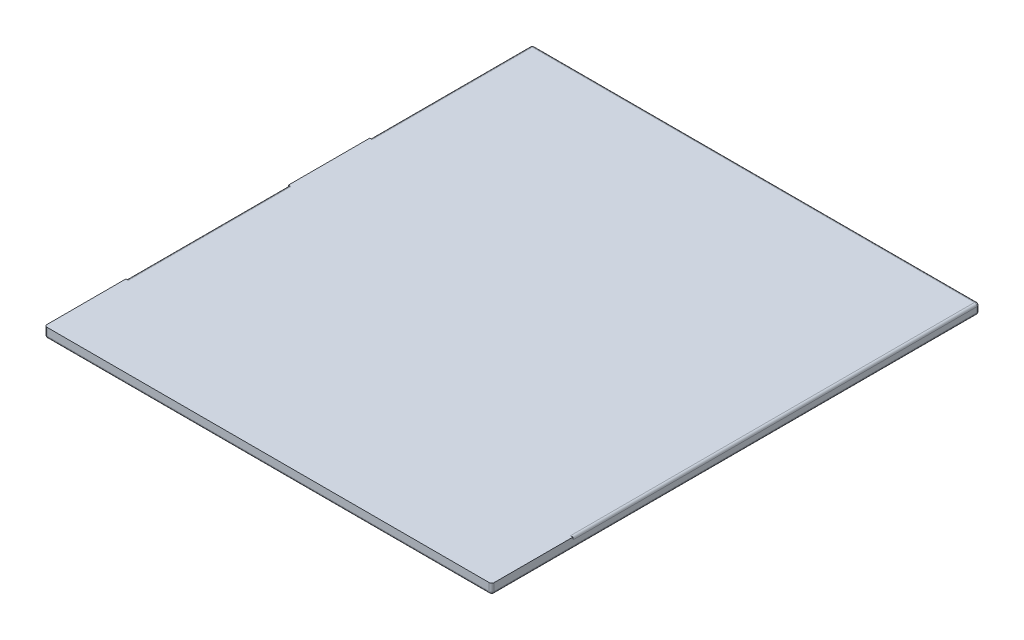
ISO-10303-21;
HEADER;
FILE_DESCRIPTION(('STEP AP214'),'2;1');
FILE_NAME('part.step','',(''),(''),'','','');
FILE_SCHEMA(('AUTOMOTIVE_DESIGN { 1 0 10303 214 1 1 1 1 }'));
ENDSEC;
DATA;
#1=APPLICATION_CONTEXT('core data for automotive mechanical design processes');
#2=APPLICATION_PROTOCOL_DEFINITION('international standard','automotive_design',2000,#1);
#3=PRODUCT_CONTEXT('',#1,'mechanical');
#4=PRODUCT('Part','Part','',(#3));
#5=PRODUCT_RELATED_PRODUCT_CATEGORY('part','',(#4));
#6=PRODUCT_DEFINITION_FORMATION('','',#4);
#7=PRODUCT_DEFINITION_CONTEXT('part definition',#1,'design');
#8=PRODUCT_DEFINITION('design','',#6,#7);
#9=PRODUCT_DEFINITION_SHAPE('','',#8);
#10=(LENGTH_UNIT() NAMED_UNIT(*) SI_UNIT(.MILLI.,.METRE.));
#11=(NAMED_UNIT(*) PLANE_ANGLE_UNIT() SI_UNIT($,.RADIAN.));
#12=(NAMED_UNIT(*) SI_UNIT($,.STERADIAN.) SOLID_ANGLE_UNIT());
#13=UNCERTAINTY_MEASURE_WITH_UNIT(LENGTH_MEASURE(1.E-05),#10,'distance_accuracy_value','');
#14=(GEOMETRIC_REPRESENTATION_CONTEXT(3) GLOBAL_UNCERTAINTY_ASSIGNED_CONTEXT((#13)) GLOBAL_UNIT_ASSIGNED_CONTEXT((#10,
#11,#12)) REPRESENTATION_CONTEXT('',''));
#15=CARTESIAN_POINT('',(0.,0.,0.));
#16=DIRECTION('',(0.,0.,1.));
#17=DIRECTION('',(1.,0.,0.));
#18=AXIS2_PLACEMENT_3D('',#15,#16,#17);
#19=CARTESIAN_POINT('',(0.,3.175,0.));
#20=DIRECTION('',(1.,0.,0.));
#21=DIRECTION('',(0.,0.,-1.));
#22=AXIS2_PLACEMENT_3D('',#19,#20,#21);
#23=PLANE('',#22);
#24=DIRECTION('',(0.,0.,1.));
#25=VECTOR('',#24,1.);
#26=CARTESIAN_POINT('',(0.,2.413,0.));
#27=LINE('',#26,#25);
#28=CARTESIAN_POINT('',(0.,2.413,-101.6));
#29=VERTEX_POINT('',#28);
#30=CARTESIAN_POINT('',(0.,2.413,-151.638));
#31=VERTEX_POINT('',#30);
#32=EDGE_CURVE('E258',#29,#31,#27,.F.);
#33=ORIENTED_EDGE('',*,*,#32,.T.);
#34=DIRECTION('',(0.,-1.,0.));
#35=VECTOR('',#34,1.);
#36=CARTESIAN_POINT('',(0.,3.175,-151.638));
#37=LINE('',#36,#35);
#38=CARTESIAN_POINT('',(0.,0.762,-151.638));
#39=VERTEX_POINT('',#38);
#40=EDGE_CURVE('E11',#31,#39,#37,.T.);
#41=ORIENTED_EDGE('',*,*,#40,.T.);
#42=DIRECTION('',(0.,0.,1.));
#43=VECTOR('',#42,1.);
#44=CARTESIAN_POINT('',(0.,0.762,0.));
#45=LINE('',#44,#43);
#46=CARTESIAN_POINT('',(0.,0.762,-0.762));
#47=VERTEX_POINT('',#46);
#48=EDGE_CURVE('E218',#39,#47,#45,.T.);
#49=ORIENTED_EDGE('',*,*,#48,.T.);
#50=DIRECTION('',(0.,-1.,0.));
#51=VECTOR('',#50,1.);
#52=CARTESIAN_POINT('',(0.,3.175,-0.762));
#53=LINE('',#52,#51);
#54=CARTESIAN_POINT('',(0.,3.175,-0.762));
#55=VERTEX_POINT('',#54);
#56=EDGE_CURVE('E216',#47,#55,#53,.F.);
#57=ORIENTED_EDGE('',*,*,#56,.T.);
#58=DIRECTION('',(0.,0.,1.));
#59=VECTOR('',#58,1.);
#60=CARTESIAN_POINT('',(0.,3.175,0.));
#61=LINE('',#60,#59);
#62=CARTESIAN_POINT('',(0.,3.175,-25.4));
#63=VERTEX_POINT('',#62);
#64=EDGE_CURVE('E170',#63,#55,#61,.T.);
#65=ORIENTED_EDGE('',*,*,#64,.F.);
#66=DIRECTION('',(0.,-1.,0.));
#67=VECTOR('',#66,1.);
#68=CARTESIAN_POINT('',(0.,2.413,-25.4));
#69=LINE('',#68,#67);
#70=CARTESIAN_POINT('',(0.,2.413,-25.4));
#71=VERTEX_POINT('',#70);
#72=EDGE_CURVE('E275',#63,#71,#69,.T.);
#73=ORIENTED_EDGE('',*,*,#72,.T.);
#74=DIRECTION('',(0.,0.,1.));
#75=VECTOR('',#74,1.);
#76=CARTESIAN_POINT('',(0.,2.413,0.));
#77=LINE('',#76,#75);
#78=CARTESIAN_POINT('',(0.,2.413,-76.1999999999998));
#79=VERTEX_POINT('',#78);
#80=EDGE_CURVE('E273',#71,#79,#77,.F.);
#81=ORIENTED_EDGE('',*,*,#80,.T.);
#82=DIRECTION('',(0.,1.,0.));
#83=VECTOR('',#82,1.);
#84=CARTESIAN_POINT('',(0.,2.413,-76.1999999999998));
#85=LINE('',#84,#83);
#86=CARTESIAN_POINT('',(0.,3.175,-76.1999999999997));
#87=VERTEX_POINT('',#86);
#88=EDGE_CURVE('E271',#79,#87,#85,.T.);
#89=ORIENTED_EDGE('',*,*,#88,.T.);
#90=CARTESIAN_POINT('',(0.,3.175,-101.6));
#91=VERTEX_POINT('',#90);
#92=EDGE_CURVE('E186',#91,#87,#61,.T.);
#93=ORIENTED_EDGE('',*,*,#92,.F.);
#94=DIRECTION('',(0.,-1.,0.));
#95=VECTOR('',#94,1.);
#96=CARTESIAN_POINT('',(0.,2.413,-101.6));
#97=LINE('',#96,#95);
#98=EDGE_CURVE('E260',#91,#29,#97,.T.);
#99=ORIENTED_EDGE('',*,*,#98,.T.);
#100=EDGE_LOOP('',(#33,#41,#49,#57,#65,#73,#81,#89,#93,#99));
#101=FACE_BOUND('',#100,.T.);
#102=ADVANCED_FACE('F43',(#101),#23,.F.);
#103=CARTESIAN_POINT('',(0.,3.175,0.));
#104=DIRECTION('',(0.,0.,-1.));
#105=DIRECTION('',(-1.,0.,0.));
#106=AXIS2_PLACEMENT_3D('',#103,#104,#105);
#107=PLANE('',#106);
#108=DIRECTION('',(1.,0.,0.));
#109=VECTOR('',#108,1.);
#110=CARTESIAN_POINT('',(0.,3.175,0.));
#111=LINE('',#110,#109);
#112=CARTESIAN_POINT('',(0.762,3.175,0.));
#113=VERTEX_POINT('',#112);
#114=CARTESIAN_POINT('',(138.938,3.175,0.));
#115=VERTEX_POINT('',#114);
#116=EDGE_CURVE('E167',#113,#115,#111,.T.);
#117=ORIENTED_EDGE('',*,*,#116,.F.);
#118=DIRECTION('',(0.,-1.,0.));
#119=VECTOR('',#118,1.);
#120=CARTESIAN_POINT('',(0.762,3.175,0.));
#121=LINE('',#120,#119);
#122=CARTESIAN_POINT('',(0.762,0.762,0.));
#123=VERTEX_POINT('',#122);
#124=EDGE_CURVE('E181',#113,#123,#121,.T.);
#125=ORIENTED_EDGE('',*,*,#124,.T.);
#126=DIRECTION('',(1.,0.,0.));
#127=VECTOR('',#126,1.);
#128=CARTESIAN_POINT('',(139.7,0.762,0.));
#129=LINE('',#128,#127);
#130=CARTESIAN_POINT('',(138.938,0.762,0.));
#131=VERTEX_POINT('',#130);
#132=EDGE_CURVE('E193',#123,#131,#129,.T.);
#133=ORIENTED_EDGE('',*,*,#132,.T.);
#134=DIRECTION('',(0.,-1.,0.));
#135=VECTOR('',#134,1.);
#136=CARTESIAN_POINT('',(138.938,3.175,0.));
#137=LINE('',#136,#135);
#138=EDGE_CURVE('E184',#131,#115,#137,.F.);
#139=ORIENTED_EDGE('',*,*,#138,.T.);
#140=EDGE_LOOP('',(#117,#125,#133,#139));
#141=FACE_BOUND('',#140,.T.);
#142=ADVANCED_FACE('F179',(#141),#107,.F.);
#143=CARTESIAN_POINT('',(139.7,3.175,0.));
#144=DIRECTION('',(-1.,0.,0.));
#145=DIRECTION('',(0.,0.,1.));
#146=AXIS2_PLACEMENT_3D('',#143,#144,#145);
#147=PLANE('',#146);
#148=DIRECTION('',(0.,0.,-1.));
#149=VECTOR('',#148,1.);
#150=CARTESIAN_POINT('',(139.7,0.762,-152.4));
#151=LINE('',#150,#149);
#152=CARTESIAN_POINT('',(139.7,0.762,-0.762));
#153=VERTEX_POINT('',#152);
#154=CARTESIAN_POINT('',(139.7,0.762,-151.638));
#155=VERTEX_POINT('',#154);
#156=EDGE_CURVE('E210',#153,#155,#151,.T.);
#157=ORIENTED_EDGE('',*,*,#156,.T.);
#158=DIRECTION('',(0.,-1.,0.));
#159=VECTOR('',#158,1.);
#160=CARTESIAN_POINT('',(139.7,3.175,-151.638));
#161=LINE('',#160,#159);
#162=CARTESIAN_POINT('',(139.7,2.413,-151.638));
#163=VERTEX_POINT('',#162);
#164=EDGE_CURVE('E52',#155,#163,#161,.F.);
#165=ORIENTED_EDGE('',*,*,#164,.T.);
#166=DIRECTION('',(0.,0.,-1.));
#167=VECTOR('',#166,1.);
#168=CARTESIAN_POINT('',(139.7,2.413,0.));
#169=LINE('',#168,#167);
#170=CARTESIAN_POINT('',(139.7,2.413,-25.4));
#171=VERTEX_POINT('',#170);
#172=EDGE_CURVE('E243',#163,#171,#169,.F.);
#173=ORIENTED_EDGE('',*,*,#172,.T.);
#174=DIRECTION('',(0.,1.,0.));
#175=VECTOR('',#174,1.);
#176=CARTESIAN_POINT('',(139.7,2.413,-25.4));
#177=LINE('',#176,#175);
#178=CARTESIAN_POINT('',(139.7,3.175,-25.4));
#179=VERTEX_POINT('',#178);
#180=EDGE_CURVE('E241',#171,#179,#177,.T.);
#181=ORIENTED_EDGE('',*,*,#180,.T.);
#182=DIRECTION('',(0.,0.,-1.));
#183=VECTOR('',#182,1.);
#184=CARTESIAN_POINT('',(139.7,3.175,0.));
#185=LINE('',#184,#183);
#186=CARTESIAN_POINT('',(139.7,3.175,-0.762));
#187=VERTEX_POINT('',#186);
#188=EDGE_CURVE('E185',#187,#179,#185,.T.);
#189=ORIENTED_EDGE('',*,*,#188,.F.);
#190=DIRECTION('',(0.,-1.,0.));
#191=VECTOR('',#190,1.);
#192=CARTESIAN_POINT('',(139.7,3.175,-0.762));
#193=LINE('',#192,#191);
#194=EDGE_CURVE('E208',#187,#153,#193,.T.);
#195=ORIENTED_EDGE('',*,*,#194,.T.);
#196=EDGE_LOOP('',(#157,#165,#173,#181,#189,#195));
#197=FACE_BOUND('',#196,.T.);
#198=ADVANCED_FACE('F346',(#197),#147,.F.);
#199=CARTESIAN_POINT('',(0.,3.175,-152.4));
#200=DIRECTION('',(0.,0.,1.));
#201=DIRECTION('',(1.,0.,0.));
#202=AXIS2_PLACEMENT_3D('',#199,#200,#201);
#203=PLANE('',#202);
#204=DIRECTION('',(-1.,0.,0.));
#205=VECTOR('',#204,1.);
#206=CARTESIAN_POINT('',(0.,2.413,-152.4));
#207=LINE('',#206,#205);
#208=CARTESIAN_POINT('',(0.761999999999972,2.413,-152.4));
#209=VERTEX_POINT('',#208);
#210=CARTESIAN_POINT('',(138.938,2.413,-152.4));
#211=VERTEX_POINT('',#210);
#212=EDGE_CURVE('E250',#209,#211,#207,.F.);
#213=ORIENTED_EDGE('',*,*,#212,.T.);
#214=DIRECTION('',(0.,-1.,0.));
#215=VECTOR('',#214,1.);
#216=CARTESIAN_POINT('',(138.938,3.175,-152.4));
#217=LINE('',#216,#215);
#218=CARTESIAN_POINT('',(138.938,0.762,-152.4));
#219=VERTEX_POINT('',#218);
#220=EDGE_CURVE('E301',#211,#219,#217,.T.);
#221=ORIENTED_EDGE('',*,*,#220,.T.);
#222=DIRECTION('',(-1.,0.,0.));
#223=VECTOR('',#222,1.);
#224=CARTESIAN_POINT('',(0.,0.762,-152.4));
#225=LINE('',#224,#223);
#226=CARTESIAN_POINT('',(0.761999999999972,0.762,-152.4));
#227=VERTEX_POINT('',#226);
#228=EDGE_CURVE('E213',#219,#227,#225,.T.);
#229=ORIENTED_EDGE('',*,*,#228,.T.);
#230=DIRECTION('',(0.,-1.,0.));
#231=VECTOR('',#230,1.);
#232=CARTESIAN_POINT('',(0.761999999999972,3.175,-152.4));
#233=LINE('',#232,#231);
#234=EDGE_CURVE('E299',#227,#209,#233,.F.);
#235=ORIENTED_EDGE('',*,*,#234,.T.);
#236=EDGE_LOOP('',(#213,#221,#229,#235));
#237=FACE_BOUND('',#236,.T.);
#238=ADVANCED_FACE('F616',(#237),#203,.F.);
#239=CARTESIAN_POINT('',(0.,3.175,0.));
#240=DIRECTION('',(0.,-1.,0.));
#241=DIRECTION('',(0.,0.,-1.));
#242=AXIS2_PLACEMENT_3D('',#239,#240,#241);
#243=PLANE('',#242);
#244=ORIENTED_EDGE('',*,*,#92,.T.);
#245=DIRECTION('',(1.,0.,0.));
#246=VECTOR('',#245,1.);
#247=CARTESIAN_POINT('',(0.761999999999986,3.175,-76.1999999999998));
#248=LINE('',#247,#246);
#249=CARTESIAN_POINT('',(0.761999999999986,3.175,-76.1999999999998));
#250=VERTEX_POINT('',#249);
#251=EDGE_CURVE('E268',#87,#250,#248,.T.);
#252=ORIENTED_EDGE('',*,*,#251,.T.);
#253=DIRECTION('',(0.,0.,1.));
#254=VECTOR('',#253,1.);
#255=CARTESIAN_POINT('',(0.762,3.175,0.));
#256=LINE('',#255,#254);
#257=CARTESIAN_POINT('',(0.761999999999995,3.175,-25.4));
#258=VERTEX_POINT('',#257);
#259=EDGE_CURVE('E266',#250,#258,#256,.T.);
#260=ORIENTED_EDGE('',*,*,#259,.T.);
#261=DIRECTION('',(-1.,0.,0.));
#262=VECTOR('',#261,1.);
#263=CARTESIAN_POINT('',(0.761999999999995,3.175,-25.4));
#264=LINE('',#263,#262);
#265=EDGE_CURVE('E262',#258,#63,#264,.T.);
#266=ORIENTED_EDGE('',*,*,#265,.T.);
#267=ORIENTED_EDGE('',*,*,#64,.T.);
#268=CARTESIAN_POINT('',(0.762,3.175,-0.762));
#269=DIRECTION('',(0.,-1.,0.));
#270=DIRECTION('',(0.,0.,-1.));
#271=AXIS2_PLACEMENT_3D('',#268,#269,#270);
#272=CIRCLE('',#271,0.762);
#273=EDGE_CURVE('E163',#55,#113,#272,.F.);
#274=ORIENTED_EDGE('',*,*,#273,.T.);
#275=ORIENTED_EDGE('',*,*,#116,.T.);
#276=CARTESIAN_POINT('',(138.938,3.175,-0.762));
#277=DIRECTION('',(0.,-1.,0.));
#278=DIRECTION('',(0.,0.,-1.));
#279=AXIS2_PLACEMENT_3D('',#276,#277,#278);
#280=CIRCLE('',#279,0.762);
#281=EDGE_CURVE('E176',#115,#187,#280,.F.);
#282=ORIENTED_EDGE('',*,*,#281,.T.);
#283=ORIENTED_EDGE('',*,*,#188,.T.);
#284=DIRECTION('',(-1.,0.,0.));
#285=VECTOR('',#284,1.);
#286=CARTESIAN_POINT('',(138.938,3.175,-25.4));
#287=LINE('',#286,#285);
#288=CARTESIAN_POINT('',(138.938,3.175,-25.4));
#289=VERTEX_POINT('',#288);
#290=EDGE_CURVE('E238',#179,#289,#287,.T.);
#291=ORIENTED_EDGE('',*,*,#290,.T.);
#292=DIRECTION('',(0.,0.,-1.));
#293=VECTOR('',#292,1.);
#294=CARTESIAN_POINT('',(138.938,3.175,0.));
#295=LINE('',#294,#293);
#296=CARTESIAN_POINT('',(138.938,3.175,-151.638));
#297=VERTEX_POINT('',#296);
#298=EDGE_CURVE('E175',#289,#297,#295,.T.);
#299=ORIENTED_EDGE('',*,*,#298,.T.);
#300=DIRECTION('',(-1.,0.,0.));
#301=VECTOR('',#300,1.);
#302=CARTESIAN_POINT('',(0.,3.175,-151.638));
#303=LINE('',#302,#301);
#304=CARTESIAN_POINT('',(0.761999999999972,3.175,-151.638));
#305=VERTEX_POINT('',#304);
#306=EDGE_CURVE('E245',#297,#305,#303,.T.);
#307=ORIENTED_EDGE('',*,*,#306,.T.);
#308=DIRECTION('',(0.,0.,1.));
#309=VECTOR('',#308,1.);
#310=CARTESIAN_POINT('',(0.762,3.175,0.));
#311=LINE('',#310,#309);
#312=CARTESIAN_POINT('',(0.761999999999982,3.175,-101.6));
#313=VERTEX_POINT('',#312);
#314=EDGE_CURVE('E255',#305,#313,#311,.T.);
#315=ORIENTED_EDGE('',*,*,#314,.T.);
#316=DIRECTION('',(-1.,0.,0.));
#317=VECTOR('',#316,1.);
#318=CARTESIAN_POINT('',(0.761999999999981,3.175,-101.6));
#319=LINE('',#318,#317);
#320=EDGE_CURVE('E253',#313,#91,#319,.T.);
#321=ORIENTED_EDGE('',*,*,#320,.T.);
#322=EDGE_LOOP('',(#244,#252,#260,#266,#267,#274,#275,#282,#283,#291,#299,#307,#315,#321));
#323=FACE_BOUND('',#322,.T.);
#324=ADVANCED_FACE('F166',(#323),#243,.F.);
#325=CARTESIAN_POINT('',(0.,0.,0.));
#326=DIRECTION('',(0.,-1.,0.));
#327=DIRECTION('',(0.,0.,-1.));
#328=AXIS2_PLACEMENT_3D('',#325,#326,#327);
#329=PLANE('',#328);
#330=DIRECTION('',(0.,0.,-1.));
#331=VECTOR('',#330,1.);
#332=CARTESIAN_POINT('',(138.938,0.,0.));
#333=LINE('',#332,#331);
#334=CARTESIAN_POINT('',(138.938,0.,-151.638));
#335=VERTEX_POINT('',#334);
#336=CARTESIAN_POINT('',(138.938,0.,-0.762));
#337=VERTEX_POINT('',#336);
#338=EDGE_CURVE('E203',#335,#337,#333,.F.);
#339=ORIENTED_EDGE('',*,*,#338,.T.);
#340=DIRECTION('',(1.,0.,0.));
#341=VECTOR('',#340,1.);
#342=CARTESIAN_POINT('',(0.,0.,-0.762));
#343=LINE('',#342,#341);
#344=CARTESIAN_POINT('',(0.762,0.,-0.762));
#345=VERTEX_POINT('',#344);
#346=EDGE_CURVE('E205',#337,#345,#343,.F.);
#347=ORIENTED_EDGE('',*,*,#346,.T.);
#348=DIRECTION('',(0.,0.,1.));
#349=VECTOR('',#348,1.);
#350=CARTESIAN_POINT('',(0.761999999999972,0.,-152.4));
#351=LINE('',#350,#349);
#352=CARTESIAN_POINT('',(0.761999999999972,0.,-151.638));
#353=VERTEX_POINT('',#352);
#354=EDGE_CURVE('E192',#345,#353,#351,.F.);
#355=ORIENTED_EDGE('',*,*,#354,.T.);
#356=DIRECTION('',(-1.,0.,0.));
#357=VECTOR('',#356,1.);
#358=CARTESIAN_POINT('',(139.7,0.,-151.638));
#359=LINE('',#358,#357);
#360=EDGE_CURVE('E196',#353,#335,#359,.F.);
#361=ORIENTED_EDGE('',*,*,#360,.T.);
#362=EDGE_LOOP('',(#339,#347,#355,#361));
#363=FACE_BOUND('',#362,.T.);
#364=ADVANCED_FACE('F327',(#363),#329,.T.);
#365=CARTESIAN_POINT('',(0.,0.762,-151.638));
#366=DIRECTION('',(1.,0.,0.));
#367=DIRECTION('',(0.,0.,-1.));
#368=AXIS2_PLACEMENT_3D('',#365,#366,#367);
#369=CYLINDRICAL_SURFACE('',#368,0.762);
#370=ORIENTED_EDGE('',*,*,#228,.F.);
#371=CARTESIAN_POINT('',(138.938,0.762,-151.638));
#372=DIRECTION('',(1.,0.,0.));
#373=DIRECTION('',(0.,0.,-1.));
#374=AXIS2_PLACEMENT_3D('',#371,#372,#373);
#375=CIRCLE('',#374,0.762);
#376=EDGE_CURVE('E294',#219,#335,#375,.F.);
#377=ORIENTED_EDGE('',*,*,#376,.T.);
#378=ORIENTED_EDGE('',*,*,#360,.F.);
#379=CARTESIAN_POINT('',(0.761999999999972,0.762,-151.638));
#380=DIRECTION('',(1.,0.,0.));
#381=DIRECTION('',(0.,0.,-1.));
#382=AXIS2_PLACEMENT_3D('',#379,#380,#381);
#383=CIRCLE('',#382,0.762);
#384=EDGE_CURVE('E292',#353,#227,#383,.T.);
#385=ORIENTED_EDGE('',*,*,#384,.T.);
#386=EDGE_LOOP('',(#370,#377,#378,#385));
#387=FACE_BOUND('',#386,.T.);
#388=ADVANCED_FACE('F332',(#387),#369,.T.);
#389=CARTESIAN_POINT('',(0.762,0.762,0.));
#390=DIRECTION('',(0.,0.,-1.));
#391=DIRECTION('',(-1.,0.,0.));
#392=AXIS2_PLACEMENT_3D('',#389,#390,#391);
#393=CYLINDRICAL_SURFACE('',#392,0.762);
#394=ORIENTED_EDGE('',*,*,#48,.F.);
#395=CARTESIAN_POINT('',(0.761999999999972,0.762,-151.638));
#396=DIRECTION('',(0.,0.,-1.));
#397=DIRECTION('',(-1.,0.,0.));
#398=AXIS2_PLACEMENT_3D('',#395,#396,#397);
#399=CIRCLE('',#398,0.762);
#400=EDGE_CURVE('E297',#39,#353,#399,.F.);
#401=ORIENTED_EDGE('',*,*,#400,.T.);
#402=ORIENTED_EDGE('',*,*,#354,.F.);
#403=CARTESIAN_POINT('',(0.762,0.762,-0.762));
#404=DIRECTION('',(0.,0.,1.));
#405=DIRECTION('',(1.,0.,0.));
#406=AXIS2_PLACEMENT_3D('',#403,#404,#405);
#407=CIRCLE('',#406,0.762);
#408=EDGE_CURVE('E233',#47,#345,#407,.T.);
#409=ORIENTED_EDGE('',*,*,#408,.F.);
#410=EDGE_LOOP('',(#394,#401,#402,#409));
#411=FACE_BOUND('',#410,.T.);
#412=ADVANCED_FACE('F323',(#411),#393,.T.);
#413=CARTESIAN_POINT('',(0.762,3.175,-0.762));
#414=DIRECTION('',(0.,-1.,0.));
#415=DIRECTION('',(0.,0.,-1.));
#416=AXIS2_PLACEMENT_3D('',#413,#414,#415);
#417=CYLINDRICAL_SURFACE('',#416,0.762);
#418=ORIENTED_EDGE('',*,*,#273,.F.);
#419=ORIENTED_EDGE('',*,*,#56,.F.);
#420=CARTESIAN_POINT('',(0.762,0.762,-0.762));
#421=DIRECTION('',(0.,-1.,0.));
#422=DIRECTION('',(0.,0.,-1.));
#423=AXIS2_PLACEMENT_3D('',#420,#421,#422);
#424=CIRCLE('',#423,0.762);
#425=EDGE_CURVE('E190',#123,#47,#424,.T.);
#426=ORIENTED_EDGE('',*,*,#425,.F.);
#427=ORIENTED_EDGE('',*,*,#124,.F.);
#428=EDGE_LOOP('',(#418,#419,#426,#427));
#429=FACE_BOUND('',#428,.T.);
#430=ADVANCED_FACE('F188',(#429),#417,.T.);
#431=CARTESIAN_POINT('',(138.938,3.175,-0.762));
#432=DIRECTION('',(0.,-1.,0.));
#433=DIRECTION('',(0.,0.,-1.));
#434=AXIS2_PLACEMENT_3D('',#431,#432,#433);
#435=CYLINDRICAL_SURFACE('',#434,0.762);
#436=ORIENTED_EDGE('',*,*,#281,.F.);
#437=ORIENTED_EDGE('',*,*,#138,.F.);
#438=CARTESIAN_POINT('',(138.938,0.762,-0.762));
#439=DIRECTION('',(0.,-1.,0.));
#440=DIRECTION('',(0.,0.,-1.));
#441=AXIS2_PLACEMENT_3D('',#438,#439,#440);
#442=CIRCLE('',#441,0.762);
#443=EDGE_CURVE('E229',#153,#131,#442,.T.);
#444=ORIENTED_EDGE('',*,*,#443,.F.);
#445=ORIENTED_EDGE('',*,*,#194,.F.);
#446=EDGE_LOOP('',(#436,#437,#444,#445));
#447=FACE_BOUND('',#446,.T.);
#448=ADVANCED_FACE('F389',(#447),#435,.T.);
#449=CARTESIAN_POINT('',(138.938,0.762,0.));
#450=DIRECTION('',(0.,0.,1.));
#451=DIRECTION('',(1.,0.,0.));
#452=AXIS2_PLACEMENT_3D('',#449,#450,#451);
#453=CYLINDRICAL_SURFACE('',#452,0.762);
#454=ORIENTED_EDGE('',*,*,#338,.F.);
#455=CARTESIAN_POINT('',(138.938,0.762,-151.638));
#456=DIRECTION('',(0.,0.,1.));
#457=DIRECTION('',(1.,0.,0.));
#458=AXIS2_PLACEMENT_3D('',#455,#456,#457);
#459=CIRCLE('',#458,0.762);
#460=EDGE_CURVE('E290',#335,#155,#459,.T.);
#461=ORIENTED_EDGE('',*,*,#460,.T.);
#462=ORIENTED_EDGE('',*,*,#156,.F.);
#463=CARTESIAN_POINT('',(138.938,0.762,-0.762));
#464=DIRECTION('',(0.,0.,1.));
#465=DIRECTION('',(1.,0.,0.));
#466=AXIS2_PLACEMENT_3D('',#463,#464,#465);
#467=CIRCLE('',#466,0.762);
#468=EDGE_CURVE('E226',#337,#153,#467,.T.);
#469=ORIENTED_EDGE('',*,*,#468,.F.);
#470=EDGE_LOOP('',(#454,#461,#462,#469));
#471=FACE_BOUND('',#470,.T.);
#472=ADVANCED_FACE('F391',(#471),#453,.T.);
#473=CARTESIAN_POINT('',(0.762,0.762,-0.762));
#474=DIRECTION('',(-1.,0.,0.));
#475=DIRECTION('',(0.,0.,1.));
#476=AXIS2_PLACEMENT_3D('',#473,#474,#475);
#477=SPHERICAL_SURFACE('',#476,0.762);
#478=ORIENTED_EDGE('',*,*,#425,.T.);
#479=ORIENTED_EDGE('',*,*,#408,.T.);
#480=CARTESIAN_POINT('',(0.762,0.762,-0.762));
#481=DIRECTION('',(-1.,0.,0.));
#482=DIRECTION('',(0.,0.,1.));
#483=AXIS2_PLACEMENT_3D('',#480,#481,#482);
#484=CIRCLE('',#483,0.762);
#485=EDGE_CURVE('E223',#123,#345,#484,.F.);
#486=ORIENTED_EDGE('',*,*,#485,.F.);
#487=EDGE_LOOP('',(#478,#479,#486));
#488=FACE_BOUND('',#487,.T.);
#489=ADVANCED_FACE('F379',(#488),#477,.T.);
#490=CARTESIAN_POINT('',(138.938,0.762,-0.762));
#491=DIRECTION('',(1.,0.,0.));
#492=DIRECTION('',(0.,0.,-1.));
#493=AXIS2_PLACEMENT_3D('',#490,#491,#492);
#494=SPHERICAL_SURFACE('',#493,0.762);
#495=ORIENTED_EDGE('',*,*,#468,.T.);
#496=ORIENTED_EDGE('',*,*,#443,.T.);
#497=CARTESIAN_POINT('',(138.938,0.762,-0.762));
#498=DIRECTION('',(1.,0.,0.));
#499=DIRECTION('',(0.,0.,-1.));
#500=AXIS2_PLACEMENT_3D('',#497,#498,#499);
#501=CIRCLE('',#500,0.762);
#502=EDGE_CURVE('E221',#337,#131,#501,.F.);
#503=ORIENTED_EDGE('',*,*,#502,.F.);
#504=EDGE_LOOP('',(#495,#496,#503));
#505=FACE_BOUND('',#504,.T.);
#506=ADVANCED_FACE('F386',(#505),#494,.T.);
#507=CARTESIAN_POINT('',(0.,0.762,-0.762));
#508=DIRECTION('',(-1.,0.,0.));
#509=DIRECTION('',(0.,0.,1.));
#510=AXIS2_PLACEMENT_3D('',#507,#508,#509);
#511=CYLINDRICAL_SURFACE('',#510,0.762);
#512=ORIENTED_EDGE('',*,*,#485,.T.);
#513=ORIENTED_EDGE('',*,*,#346,.F.);
#514=ORIENTED_EDGE('',*,*,#502,.T.);
#515=ORIENTED_EDGE('',*,*,#132,.F.);
#516=EDGE_LOOP('',(#512,#513,#514,#515));
#517=FACE_BOUND('',#516,.T.);
#518=ADVANCED_FACE('F382',(#517),#511,.T.);
#519=CARTESIAN_POINT('',(138.938,2.413,0.));
#520=DIRECTION('',(0.,0.,-1.));
#521=DIRECTION('',(-1.,0.,0.));
#522=AXIS2_PLACEMENT_3D('',#519,#520,#521);
#523=CYLINDRICAL_SURFACE('',#522,0.762);
#524=ORIENTED_EDGE('',*,*,#172,.F.);
#525=CARTESIAN_POINT('',(138.938,2.413,-151.638));
#526=DIRECTION('',(0.,0.,-1.));
#527=DIRECTION('',(-1.,0.,0.));
#528=AXIS2_PLACEMENT_3D('',#525,#526,#527);
#529=CIRCLE('',#528,0.762);
#530=EDGE_CURVE('E277',#163,#297,#529,.F.);
#531=ORIENTED_EDGE('',*,*,#530,.T.);
#532=ORIENTED_EDGE('',*,*,#298,.F.);
#533=CARTESIAN_POINT('',(138.938,2.413,-25.4));
#534=DIRECTION('',(0.,0.,1.));
#535=DIRECTION('',(1.,0.,0.));
#536=AXIS2_PLACEMENT_3D('',#533,#534,#535);
#537=CIRCLE('',#536,0.762);
#538=EDGE_CURVE('E224',#171,#289,#537,.T.);
#539=ORIENTED_EDGE('',*,*,#538,.F.);
#540=EDGE_LOOP('',(#524,#531,#532,#539));
#541=FACE_BOUND('',#540,.T.);
#542=ADVANCED_FACE('F351',(#541),#523,.T.);
#543=CARTESIAN_POINT('',(138.938,2.413,-25.4));
#544=DIRECTION('',(0.,0.,-1.));
#545=DIRECTION('',(-1.,0.,0.));
#546=AXIS2_PLACEMENT_3D('',#543,#544,#545);
#547=PLANE('',#546);
#548=ORIENTED_EDGE('',*,*,#290,.F.);
#549=ORIENTED_EDGE('',*,*,#180,.F.);
#550=ORIENTED_EDGE('',*,*,#538,.T.);
#551=EDGE_LOOP('',(#548,#549,#550));
#552=FACE_BOUND('',#551,.T.);
#553=ADVANCED_FACE('F355',(#552),#547,.T.);
#554=CARTESIAN_POINT('',(0.,2.413,-151.638));
#555=DIRECTION('',(-1.,0.,0.));
#556=DIRECTION('',(0.,0.,1.));
#557=AXIS2_PLACEMENT_3D('',#554,#555,#556);
#558=CYLINDRICAL_SURFACE('',#557,0.762);
#559=ORIENTED_EDGE('',*,*,#306,.F.);
#560=CARTESIAN_POINT('',(138.938,2.413,-151.638));
#561=DIRECTION('',(-1.,0.,0.));
#562=DIRECTION('',(0.,0.,1.));
#563=AXIS2_PLACEMENT_3D('',#560,#561,#562);
#564=CIRCLE('',#563,0.762);
#565=EDGE_CURVE('E288',#297,#211,#564,.T.);
#566=ORIENTED_EDGE('',*,*,#565,.T.);
#567=ORIENTED_EDGE('',*,*,#212,.F.);
#568=CARTESIAN_POINT('',(0.761999999999972,2.413,-151.638));
#569=DIRECTION('',(-1.,0.,0.));
#570=DIRECTION('',(0.,0.,1.));
#571=AXIS2_PLACEMENT_3D('',#568,#569,#570);
#572=CIRCLE('',#571,0.762);
#573=EDGE_CURVE('E285',#209,#305,#572,.F.);
#574=ORIENTED_EDGE('',*,*,#573,.T.);
#575=EDGE_LOOP('',(#559,#566,#567,#574));
#576=FACE_BOUND('',#575,.T.);
#577=ADVANCED_FACE('F432',(#576),#558,.T.);
#578=CARTESIAN_POINT('',(0.761999999999981,2.413,-101.6));
#579=DIRECTION('',(0.,0.,-1.));
#580=DIRECTION('',(-1.,0.,0.));
#581=AXIS2_PLACEMENT_3D('',#578,#579,#580);
#582=PLANE('',#581);
#583=ORIENTED_EDGE('',*,*,#98,.F.);
#584=ORIENTED_EDGE('',*,*,#320,.F.);
#585=CARTESIAN_POINT('',(0.761999999999982,2.413,-101.6));
#586=DIRECTION('',(0.,0.,1.));
#587=DIRECTION('',(1.,0.,0.));
#588=AXIS2_PLACEMENT_3D('',#585,#586,#587);
#589=CIRCLE('',#588,0.762);
#590=EDGE_CURVE('E247',#29,#313,#589,.F.);
#591=ORIENTED_EDGE('',*,*,#590,.F.);
#592=EDGE_LOOP('',(#583,#584,#591));
#593=FACE_BOUND('',#592,.T.);
#594=ADVANCED_FACE('F438',(#593),#582,.T.);
#595=CARTESIAN_POINT('',(0.762,2.413,0.));
#596=DIRECTION('',(0.,0.,1.));
#597=DIRECTION('',(1.,0.,0.));
#598=AXIS2_PLACEMENT_3D('',#595,#596,#597);
#599=CYLINDRICAL_SURFACE('',#598,0.762);
#600=ORIENTED_EDGE('',*,*,#314,.F.);
#601=CARTESIAN_POINT('',(0.761999999999972,2.413,-151.638));
#602=DIRECTION('',(0.,0.,1.));
#603=DIRECTION('',(1.,0.,0.));
#604=AXIS2_PLACEMENT_3D('',#601,#602,#603);
#605=CIRCLE('',#604,0.762);
#606=EDGE_CURVE('E66',#305,#31,#605,.T.);
#607=ORIENTED_EDGE('',*,*,#606,.T.);
#608=ORIENTED_EDGE('',*,*,#32,.F.);
#609=ORIENTED_EDGE('',*,*,#590,.T.);
#610=EDGE_LOOP('',(#600,#607,#608,#609));
#611=FACE_BOUND('',#610,.T.);
#612=ADVANCED_FACE('F442',(#611),#599,.T.);
#613=CARTESIAN_POINT('',(0.761999999999995,2.413,-25.4));
#614=DIRECTION('',(0.,0.,-1.));
#615=DIRECTION('',(-1.,0.,0.));
#616=AXIS2_PLACEMENT_3D('',#613,#614,#615);
#617=PLANE('',#616);
#618=ORIENTED_EDGE('',*,*,#72,.F.);
#619=ORIENTED_EDGE('',*,*,#265,.F.);
#620=CARTESIAN_POINT('',(0.761999999999995,2.413,-25.4));
#621=DIRECTION('',(0.,0.,1.));
#622=DIRECTION('',(1.,0.,0.));
#623=AXIS2_PLACEMENT_3D('',#620,#621,#622);
#624=CIRCLE('',#623,0.762);
#625=EDGE_CURVE('E264',#71,#258,#624,.F.);
#626=ORIENTED_EDGE('',*,*,#625,.F.);
#627=EDGE_LOOP('',(#618,#619,#626));
#628=FACE_BOUND('',#627,.T.);
#629=ADVANCED_FACE('F377',(#628),#617,.T.);
#630=CARTESIAN_POINT('',(0.762,2.413,0.));
#631=DIRECTION('',(0.,0.,1.));
#632=DIRECTION('',(1.,0.,0.));
#633=AXIS2_PLACEMENT_3D('',#630,#631,#632);
#634=CYLINDRICAL_SURFACE('',#633,0.762);
#635=ORIENTED_EDGE('',*,*,#625,.T.);
#636=ORIENTED_EDGE('',*,*,#259,.F.);
#637=CARTESIAN_POINT('',(0.761999999999986,2.413,-76.1999999999998));
#638=DIRECTION('',(0.,0.,-1.));
#639=DIRECTION('',(-1.,0.,0.));
#640=AXIS2_PLACEMENT_3D('',#637,#638,#639);
#641=CIRCLE('',#640,0.762);
#642=EDGE_CURVE('E278',#79,#250,#641,.T.);
#643=ORIENTED_EDGE('',*,*,#642,.F.);
#644=ORIENTED_EDGE('',*,*,#80,.F.);
#645=EDGE_LOOP('',(#635,#636,#643,#644));
#646=FACE_BOUND('',#645,.T.);
#647=ADVANCED_FACE('F372',(#646),#634,.T.);
#648=CARTESIAN_POINT('',(0.761999999999986,2.413,-76.1999999999998));
#649=DIRECTION('',(0.,0.,1.));
#650=DIRECTION('',(1.,0.,0.));
#651=AXIS2_PLACEMENT_3D('',#648,#649,#650);
#652=PLANE('',#651);
#653=ORIENTED_EDGE('',*,*,#251,.F.);
#654=ORIENTED_EDGE('',*,*,#88,.F.);
#655=ORIENTED_EDGE('',*,*,#642,.T.);
#656=EDGE_LOOP('',(#653,#654,#655));
#657=FACE_BOUND('',#656,.T.);
#658=ADVANCED_FACE('F367',(#657),#652,.T.);
#659=CARTESIAN_POINT('',(138.938,0.762,-151.638));
#660=DIRECTION('',(0.,0.,1.));
#661=DIRECTION('',(1.,0.,0.));
#662=AXIS2_PLACEMENT_3D('',#659,#660,#661);
#663=SPHERICAL_SURFACE('',#662,0.762);
#664=ORIENTED_EDGE('',*,*,#460,.F.);
#665=ORIENTED_EDGE('',*,*,#376,.F.);
#666=CARTESIAN_POINT('',(138.938,0.762,-151.638));
#667=DIRECTION('',(0.,1.,0.));
#668=DIRECTION('',(0.,0.,1.));
#669=AXIS2_PLACEMENT_3D('',#666,#667,#668);
#670=CIRCLE('',#669,0.762);
#671=EDGE_CURVE('E280',#155,#219,#670,.T.);
#672=ORIENTED_EDGE('',*,*,#671,.F.);
#673=EDGE_LOOP('',(#664,#665,#672));
#674=FACE_BOUND('',#673,.T.);
#675=ADVANCED_FACE('F337',(#674),#663,.T.);
#676=CARTESIAN_POINT('',(138.938,3.175,-151.638));
#677=DIRECTION('',(0.,-1.,0.));
#678=DIRECTION('',(0.,0.,-1.));
#679=AXIS2_PLACEMENT_3D('',#676,#677,#678);
#680=CYLINDRICAL_SURFACE('',#679,0.762);
#681=ORIENTED_EDGE('',*,*,#671,.T.);
#682=ORIENTED_EDGE('',*,*,#220,.F.);
#683=CARTESIAN_POINT('',(138.938,2.413,-151.638));
#684=DIRECTION('',(0.,1.,0.));
#685=DIRECTION('',(0.,0.,1.));
#686=AXIS2_PLACEMENT_3D('',#683,#684,#685);
#687=CIRCLE('',#686,0.762);
#688=EDGE_CURVE('E304',#163,#211,#687,.T.);
#689=ORIENTED_EDGE('',*,*,#688,.F.);
#690=ORIENTED_EDGE('',*,*,#164,.F.);
#691=EDGE_LOOP('',(#681,#682,#689,#690));
#692=FACE_BOUND('',#691,.T.);
#693=ADVANCED_FACE('F341',(#692),#680,.T.);
#694=CARTESIAN_POINT('',(138.938,2.413,-151.638));
#695=DIRECTION('',(0.,0.,1.));
#696=DIRECTION('',(1.,0.,0.));
#697=AXIS2_PLACEMENT_3D('',#694,#695,#696);
#698=SPHERICAL_SURFACE('',#697,0.762);
#699=ORIENTED_EDGE('',*,*,#688,.T.);
#700=ORIENTED_EDGE('',*,*,#565,.F.);
#701=ORIENTED_EDGE('',*,*,#530,.F.);
#702=EDGE_LOOP('',(#699,#700,#701));
#703=FACE_BOUND('',#702,.T.);
#704=ADVANCED_FACE('F486',(#703),#698,.T.);
#705=CARTESIAN_POINT('',(0.761999999999972,0.762,-151.638));
#706=DIRECTION('',(0.,0.,1.));
#707=DIRECTION('',(1.,0.,0.));
#708=AXIS2_PLACEMENT_3D('',#705,#706,#707);
#709=SPHERICAL_SURFACE('',#708,0.762);
#710=ORIENTED_EDGE('',*,*,#384,.F.);
#711=ORIENTED_EDGE('',*,*,#400,.F.);
#712=CARTESIAN_POINT('',(0.761999999999972,0.762,-151.638));
#713=DIRECTION('',(0.,1.,0.));
#714=DIRECTION('',(0.,0.,1.));
#715=AXIS2_PLACEMENT_3D('',#712,#713,#714);
#716=CIRCLE('',#715,0.762);
#717=EDGE_CURVE('E47',#227,#39,#716,.T.);
#718=ORIENTED_EDGE('',*,*,#717,.F.);
#719=EDGE_LOOP('',(#710,#711,#718));
#720=FACE_BOUND('',#719,.T.);
#721=ADVANCED_FACE('F45',(#720),#709,.T.);
#722=CARTESIAN_POINT('',(0.761999999999972,3.175,-151.638));
#723=DIRECTION('',(0.,-1.,0.));
#724=DIRECTION('',(0.,0.,-1.));
#725=AXIS2_PLACEMENT_3D('',#722,#723,#724);
#726=CYLINDRICAL_SURFACE('',#725,0.762);
#727=ORIENTED_EDGE('',*,*,#717,.T.);
#728=ORIENTED_EDGE('',*,*,#40,.F.);
#729=CARTESIAN_POINT('',(0.761999999999972,2.413,-151.638));
#730=DIRECTION('',(0.,1.,0.));
#731=DIRECTION('',(0.,0.,1.));
#732=AXIS2_PLACEMENT_3D('',#729,#730,#731);
#733=CIRCLE('',#732,0.762);
#734=EDGE_CURVE('E308',#209,#31,#733,.T.);
#735=ORIENTED_EDGE('',*,*,#734,.F.);
#736=ORIENTED_EDGE('',*,*,#234,.F.);
#737=EDGE_LOOP('',(#727,#728,#735,#736));
#738=FACE_BOUND('',#737,.T.);
#739=ADVANCED_FACE('F317',(#738),#726,.T.);
#740=CARTESIAN_POINT('',(0.761999999999972,2.413,-151.638));
#741=DIRECTION('',(0.,0.,1.));
#742=DIRECTION('',(1.,0.,0.));
#743=AXIS2_PLACEMENT_3D('',#740,#741,#742);
#744=SPHERICAL_SURFACE('',#743,0.762);
#745=ORIENTED_EDGE('',*,*,#734,.T.);
#746=ORIENTED_EDGE('',*,*,#606,.F.);
#747=ORIENTED_EDGE('',*,*,#573,.F.);
#748=EDGE_LOOP('',(#745,#746,#747));
#749=FACE_BOUND('',#748,.T.);
#750=ADVANCED_FACE('F513',(#749),#744,.T.);
#751=CLOSED_SHELL('',(#102,#142,#198,#238,#324,#364,#388,#412,#430,#448,#472,#489,#506,#518,
#542,#553,#577,#594,#612,#629,#647,#658,#675,#693,#704,#721,#739,#750));
#752=MANIFOLD_SOLID_BREP('B2',#751);
#753=ADVANCED_BREP_SHAPE_REPRESENTATION('',(#18,#752),#14);
#754=SHAPE_DEFINITION_REPRESENTATION(#9,#753);
ENDSEC;
END-ISO-10303-21;
